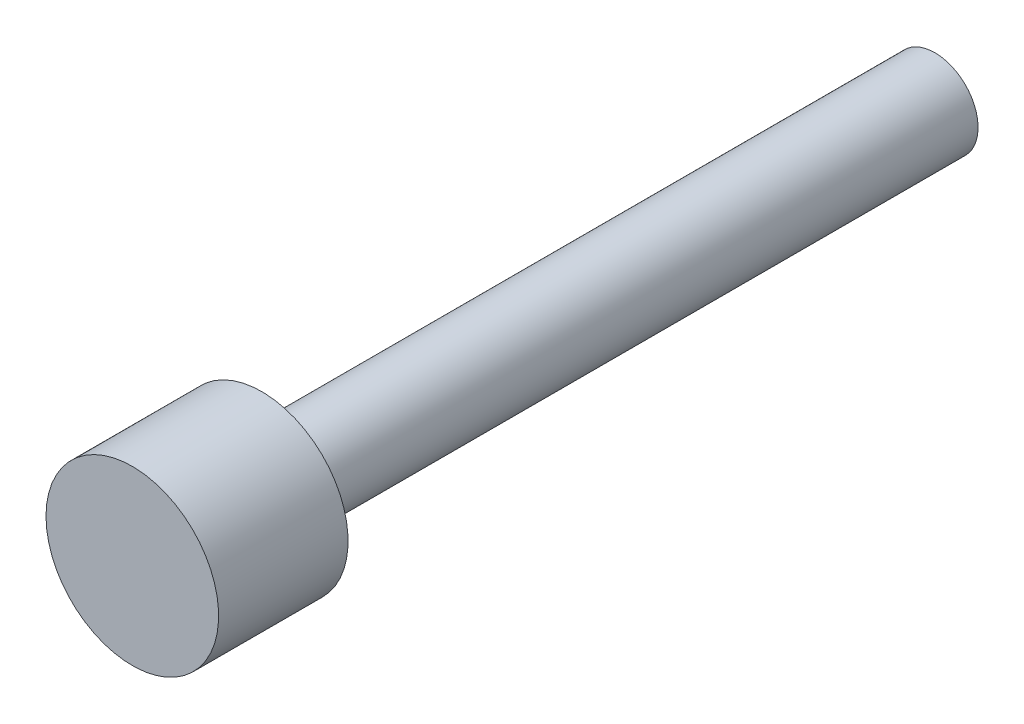
ISO-10303-21;
HEADER;
FILE_DESCRIPTION(('STEP AP214'),'2;1');
FILE_NAME('part.step','',(''),(''),'','','');
FILE_SCHEMA(('AUTOMOTIVE_DESIGN { 1 0 10303 214 1 1 1 1 }'));
ENDSEC;
DATA;
#1=APPLICATION_CONTEXT('core data for automotive mechanical design processes');
#2=APPLICATION_PROTOCOL_DEFINITION('international standard','automotive_design',2000,#1);
#3=PRODUCT_CONTEXT('',#1,'mechanical');
#4=PRODUCT('Part','Part','',(#3));
#5=PRODUCT_RELATED_PRODUCT_CATEGORY('part','',(#4));
#6=PRODUCT_DEFINITION_FORMATION('','',#4);
#7=PRODUCT_DEFINITION_CONTEXT('part definition',#1,'design');
#8=PRODUCT_DEFINITION('design','',#6,#7);
#9=PRODUCT_DEFINITION_SHAPE('','',#8);
#10=(LENGTH_UNIT() NAMED_UNIT(*) SI_UNIT(.MILLI.,.METRE.));
#11=(NAMED_UNIT(*) PLANE_ANGLE_UNIT() SI_UNIT($,.RADIAN.));
#12=(NAMED_UNIT(*) SI_UNIT($,.STERADIAN.) SOLID_ANGLE_UNIT());
#13=UNCERTAINTY_MEASURE_WITH_UNIT(LENGTH_MEASURE(1.E-05),#10,'distance_accuracy_value','');
#14=(GEOMETRIC_REPRESENTATION_CONTEXT(3) GLOBAL_UNCERTAINTY_ASSIGNED_CONTEXT((#13)) GLOBAL_UNIT_ASSIGNED_CONTEXT((#10,
#11,#12)) REPRESENTATION_CONTEXT('',''));
#15=CARTESIAN_POINT('',(0.,0.,0.));
#16=DIRECTION('',(0.,0.,1.));
#17=DIRECTION('',(1.,0.,0.));
#18=AXIS2_PLACEMENT_3D('',#15,#16,#17);
#19=CARTESIAN_POINT('',(-25.,0.,0.));
#20=DIRECTION('',(0.,0.,-1.));
#21=DIRECTION('',(-1.,0.,0.));
#22=AXIS2_PLACEMENT_3D('',#19,#20,#21);
#23=PLANE('',#22);
#24=CARTESIAN_POINT('',(0.,0.,0.));
#25=DIRECTION('',(0.,0.,-1.));
#26=DIRECTION('',(-1.,0.,0.));
#27=AXIS2_PLACEMENT_3D('',#24,#25,#26);
#28=CIRCLE('',#27,25.);
#29=CARTESIAN_POINT('',(-25.,0.,0.));
#30=VERTEX_POINT('',#29);
#31=EDGE_CURVE('E45',#30,#30,#28,.T.);
#32=ORIENTED_EDGE('',*,*,#31,.T.);
#33=EDGE_LOOP('',(#32));
#34=FACE_BOUND('',#33,.T.);
#35=ADVANCED_FACE('F31',(#34),#23,.T.);
#36=CARTESIAN_POINT('',(0.,0.,465.));
#37=DIRECTION('',(0.,0.,1.));
#38=DIRECTION('',(1.,0.,0.));
#39=AXIS2_PLACEMENT_3D('',#36,#37,#38);
#40=PLANE('',#39);
#41=CARTESIAN_POINT('',(0.,0.,465.));
#42=DIRECTION('',(0.,0.,-1.));
#43=DIRECTION('',(-1.,0.,0.));
#44=AXIS2_PLACEMENT_3D('',#41,#42,#43);
#45=CIRCLE('',#44,50.);
#46=CARTESIAN_POINT('',(-50.,0.,465.));
#47=VERTEX_POINT('',#46);
#48=EDGE_CURVE('E10',#47,#47,#45,.T.);
#49=ORIENTED_EDGE('',*,*,#48,.F.);
#50=EDGE_LOOP('',(#49));
#51=FACE_BOUND('',#50,.T.);
#52=ADVANCED_FACE('F63',(#51),#40,.T.);
#53=CARTESIAN_POINT('',(0.,0.,0.));
#54=DIRECTION('',(0.,0.,-1.));
#55=DIRECTION('',(-1.,0.,0.));
#56=AXIS2_PLACEMENT_3D('',#53,#54,#55);
#57=CYLINDRICAL_SURFACE('',#56,50.);
#58=ORIENTED_EDGE('',*,*,#48,.T.);
#59=EDGE_LOOP('',(#58));
#60=FACE_BOUND('',#59,.T.);
#61=CARTESIAN_POINT('',(0.,0.,390.));
#62=DIRECTION('',(0.,0.,-1.));
#63=DIRECTION('',(-1.,0.,0.));
#64=AXIS2_PLACEMENT_3D('',#61,#62,#63);
#65=CIRCLE('',#64,50.);
#66=CARTESIAN_POINT('',(-50.,0.,390.));
#67=VERTEX_POINT('',#66);
#68=EDGE_CURVE('E37',#67,#67,#65,.T.);
#69=ORIENTED_EDGE('',*,*,#68,.F.);
#70=EDGE_LOOP('',(#69));
#71=FACE_BOUND('',#70,.T.);
#72=ADVANCED_FACE('F60',(#60,#71),#57,.T.);
#73=CARTESIAN_POINT('',(-50.,0.,390.));
#74=DIRECTION('',(0.,0.,-1.));
#75=DIRECTION('',(-1.,0.,0.));
#76=AXIS2_PLACEMENT_3D('',#73,#74,#75);
#77=PLANE('',#76);
#78=ORIENTED_EDGE('',*,*,#68,.T.);
#79=EDGE_LOOP('',(#78));
#80=FACE_BOUND('',#79,.T.);
#81=CARTESIAN_POINT('',(0.,0.,390.));
#82=DIRECTION('',(0.,0.,-1.));
#83=DIRECTION('',(-1.,0.,0.));
#84=AXIS2_PLACEMENT_3D('',#81,#82,#83);
#85=CIRCLE('',#84,25.);
#86=CARTESIAN_POINT('',(-25.,0.,390.));
#87=VERTEX_POINT('',#86);
#88=EDGE_CURVE('E41',#87,#87,#85,.T.);
#89=ORIENTED_EDGE('',*,*,#88,.F.);
#90=EDGE_LOOP('',(#89));
#91=FACE_BOUND('',#90,.T.);
#92=ADVANCED_FACE('F54',(#80,#91),#77,.T.);
#93=CARTESIAN_POINT('',(0.,0.,0.));
#94=DIRECTION('',(0.,0.,-1.));
#95=DIRECTION('',(-1.,0.,0.));
#96=AXIS2_PLACEMENT_3D('',#93,#94,#95);
#97=CYLINDRICAL_SURFACE('',#96,25.);
#98=ORIENTED_EDGE('',*,*,#88,.T.);
#99=EDGE_LOOP('',(#98));
#100=FACE_BOUND('',#99,.T.);
#101=ORIENTED_EDGE('',*,*,#31,.F.);
#102=EDGE_LOOP('',(#101));
#103=FACE_BOUND('',#102,.T.);
#104=ADVANCED_FACE('F52',(#100,#103),#97,.T.);
#105=CLOSED_SHELL('',(#35,#52,#72,#92,#104));
#106=MANIFOLD_SOLID_BREP('B2',#105);
#107=ADVANCED_BREP_SHAPE_REPRESENTATION('',(#18,#106),#14);
#108=SHAPE_DEFINITION_REPRESENTATION(#9,#107);
ENDSEC;
END-ISO-10303-21;
